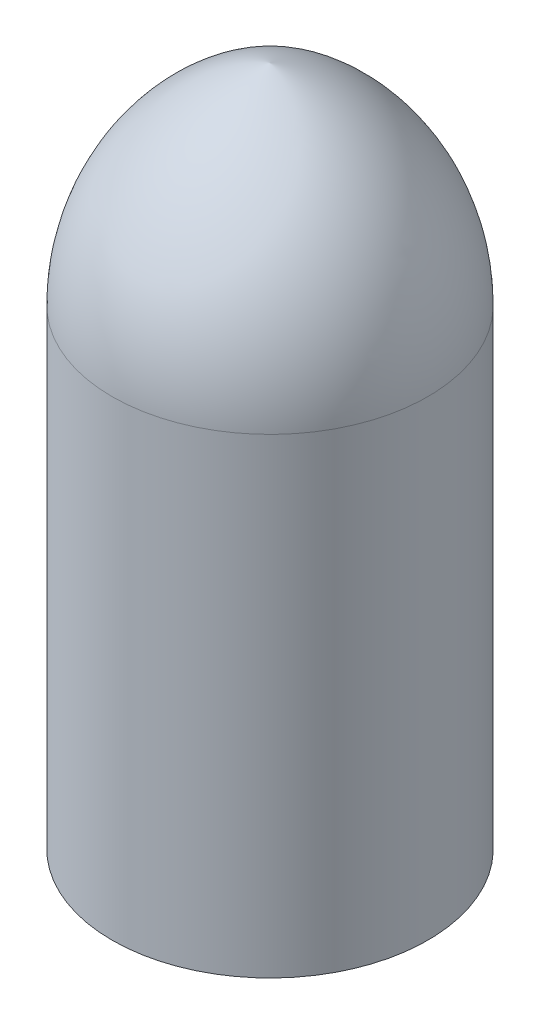
ISO-10303-21;
HEADER;
FILE_DESCRIPTION(('STEP AP214'),'2;1');
FILE_NAME('part.step','',(''),(''),'','','');
FILE_SCHEMA(('AUTOMOTIVE_DESIGN { 1 0 10303 214 1 1 1 1 }'));
ENDSEC;
DATA;
#1=APPLICATION_CONTEXT('core data for automotive mechanical design processes');
#2=APPLICATION_PROTOCOL_DEFINITION('international standard','automotive_design',2000,#1);
#3=PRODUCT_CONTEXT('',#1,'mechanical');
#4=PRODUCT('Part','Part','',(#3));
#5=PRODUCT_RELATED_PRODUCT_CATEGORY('part','',(#4));
#6=PRODUCT_DEFINITION_FORMATION('','',#4);
#7=PRODUCT_DEFINITION_CONTEXT('part definition',#1,'design');
#8=PRODUCT_DEFINITION('design','',#6,#7);
#9=PRODUCT_DEFINITION_SHAPE('','',#8);
#10=(LENGTH_UNIT() NAMED_UNIT(*) SI_UNIT(.MILLI.,.METRE.));
#11=(NAMED_UNIT(*) PLANE_ANGLE_UNIT() SI_UNIT($,.RADIAN.));
#12=(NAMED_UNIT(*) SI_UNIT($,.STERADIAN.) SOLID_ANGLE_UNIT());
#13=UNCERTAINTY_MEASURE_WITH_UNIT(LENGTH_MEASURE(1.E-05),#10,'distance_accuracy_value','');
#14=(GEOMETRIC_REPRESENTATION_CONTEXT(3) GLOBAL_UNCERTAINTY_ASSIGNED_CONTEXT((#13)) GLOBAL_UNIT_ASSIGNED_CONTEXT((#10,
#11,#12)) REPRESENTATION_CONTEXT('',''));
#15=CARTESIAN_POINT('',(0.,0.,0.));
#16=DIRECTION('',(0.,0.,1.));
#17=DIRECTION('',(1.,0.,0.));
#18=AXIS2_PLACEMENT_3D('',#15,#16,#17);
#19=CARTESIAN_POINT('',(0.,170.,21.9590163934427));
#20=DIRECTION('',(-1.,0.,0.));
#21=DIRECTION('',(0.,0.,-1.));
#22=AXIS2_PLACEMENT_3D('',#19,#20,#21);
#23=CIRCLE('',#22,76.9590163934427);
#24=TRIMMED_CURVE('',#23,(PARAMETER_VALUE(-1.28144153233185)),
(PARAMETER_VALUE(1.28144153233185)),.T.,.PARAMETER.);
#25=CARTESIAN_POINT('',(0.,170.,0.));
#26=DIRECTION('',(0.,-1.,0.));
#27=AXIS1_PLACEMENT('',#25,#26);
#28=SURFACE_OF_REVOLUTION('',#24,#27);
#29=CARTESIAN_POINT('',(0.,243.759689555195,0.));
#30=VERTEX_POINT('',#29);
#31=VERTEX_LOOP('',#30);
#32=FACE_BOUND('',#31,.T.);
#33=CARTESIAN_POINT('',(0.,170.,0.));
#34=DIRECTION('',(0.,-1.,0.));
#35=DIRECTION('',(0.,0.,-1.));
#36=AXIS2_PLACEMENT_3D('',#33,#34,#35);
#37=CIRCLE('',#36,55.);
#38=CARTESIAN_POINT('',(0.,170.,-55.));
#39=VERTEX_POINT('',#38);
#40=EDGE_CURVE('E11',#39,#39,#37,.T.);
#41=ORIENTED_EDGE('',*,*,#40,.T.);
#42=EDGE_LOOP('',(#41));
#43=FACE_BOUND('',#42,.T.);
#44=ADVANCED_FACE('F34',(#32,#43),#28,.F.);
#45=CARTESIAN_POINT('',(0.,240.623917371653,0.));
#46=DIRECTION('',(0.,-1.,0.));
#47=DIRECTION('',(0.,0.,-1.));
#48=AXIS2_PLACEMENT_3D('',#45,#46,#47);
#49=CYLINDRICAL_SURFACE('',#48,55.);
#50=ORIENTED_EDGE('',*,*,#40,.F.);
#51=EDGE_LOOP('',(#50));
#52=FACE_BOUND('',#51,.T.);
#53=CARTESIAN_POINT('',(0.,0.,0.));
#54=DIRECTION('',(0.,-1.,0.));
#55=DIRECTION('',(0.,0.,-1.));
#56=AXIS2_PLACEMENT_3D('',#53,#54,#55);
#57=CIRCLE('',#56,55.);
#58=CARTESIAN_POINT('',(0.,0.,-55.));
#59=VERTEX_POINT('',#58);
#60=EDGE_CURVE('E41',#59,#59,#57,.T.);
#61=ORIENTED_EDGE('',*,*,#60,.T.);
#62=EDGE_LOOP('',(#61));
#63=FACE_BOUND('',#62,.T.);
#64=ADVANCED_FACE('F63',(#52,#63),#49,.F.);
#65=CARTESIAN_POINT('',(0.,0.,0.));
#66=DIRECTION('',(0.,-1.,0.));
#67=DIRECTION('',(0.,0.,-1.));
#68=AXIS2_PLACEMENT_3D('',#65,#66,#67);
#69=PLANE('',#68);
#70=CARTESIAN_POINT('',(0.,0.,0.));
#71=DIRECTION('',(0.,-1.,0.));
#72=DIRECTION('',(0.,0.,-1.));
#73=AXIS2_PLACEMENT_3D('',#70,#71,#72);
#74=CIRCLE('',#73,57.);
#75=CARTESIAN_POINT('',(0.,0.,-57.));
#76=VERTEX_POINT('',#75);
#77=EDGE_CURVE('E56',#76,#76,#74,.T.);
#78=ORIENTED_EDGE('',*,*,#77,.T.);
#79=EDGE_LOOP('',(#78));
#80=FACE_BOUND('',#79,.T.);
#81=ORIENTED_EDGE('',*,*,#60,.F.);
#82=EDGE_LOOP('',(#81));
#83=FACE_BOUND('',#82,.T.);
#84=ADVANCED_FACE('F65',(#80,#83),#69,.T.);
#85=CARTESIAN_POINT('',(0.,240.623917371653,0.));
#86=DIRECTION('',(0.,-1.,0.));
#87=DIRECTION('',(0.,0.,-1.));
#88=AXIS2_PLACEMENT_3D('',#85,#86,#87);
#89=CYLINDRICAL_SURFACE('',#88,57.);
#90=CARTESIAN_POINT('',(0.,170.,0.));
#91=DIRECTION('',(0.,-1.,0.));
#92=DIRECTION('',(0.,0.,-1.));
#93=AXIS2_PLACEMENT_3D('',#90,#91,#92);
#94=CIRCLE('',#93,57.);
#95=CARTESIAN_POINT('',(0.,170.,-57.));
#96=VERTEX_POINT('',#95);
#97=EDGE_CURVE('E54',#96,#96,#94,.T.);
#98=ORIENTED_EDGE('',*,*,#97,.T.);
#99=EDGE_LOOP('',(#98));
#100=FACE_BOUND('',#99,.T.);
#101=ORIENTED_EDGE('',*,*,#77,.F.);
#102=EDGE_LOOP('',(#101));
#103=FACE_BOUND('',#102,.T.);
#104=ADVANCED_FACE('F50',(#100,#103),#89,.T.);
#105=CARTESIAN_POINT('',(0.,170.,21.9590163934427));
#106=DIRECTION('',(-1.,0.,0.));
#107=DIRECTION('',(0.,0.,-1.));
#108=AXIS2_PLACEMENT_3D('',#105,#106,#107);
#109=CIRCLE('',#108,78.9590163934427);
#110=TRIMMED_CURVE('',#109,(PARAMETER_VALUE(-1.28897403844099)),
(PARAMETER_VALUE(1.28897403844099)),.T.,.PARAMETER.);
#111=CARTESIAN_POINT('',(0.,170.,0.));
#112=DIRECTION('',(0.,-1.,0.));
#113=AXIS1_PLACEMENT('',#111,#112);
#114=SURFACE_OF_REVOLUTION('',#110,#113);
#115=CARTESIAN_POINT('',(0.,245.844102399939,0.));
#116=VERTEX_POINT('',#115);
#117=VERTEX_LOOP('',#116);
#118=FACE_BOUND('',#117,.T.);
#119=ORIENTED_EDGE('',*,*,#97,.F.);
#120=EDGE_LOOP('',(#119));
#121=FACE_BOUND('',#120,.T.);
#122=ADVANCED_FACE('F47',(#118,#121),#114,.T.);
#123=CLOSED_SHELL('',(#44,#64,#84,#104,#122));
#124=MANIFOLD_SOLID_BREP('B2',#123);
#125=ADVANCED_BREP_SHAPE_REPRESENTATION('',(#18,#124),#14);
#126=SHAPE_DEFINITION_REPRESENTATION(#9,#125);
ENDSEC;
END-ISO-10303-21;
